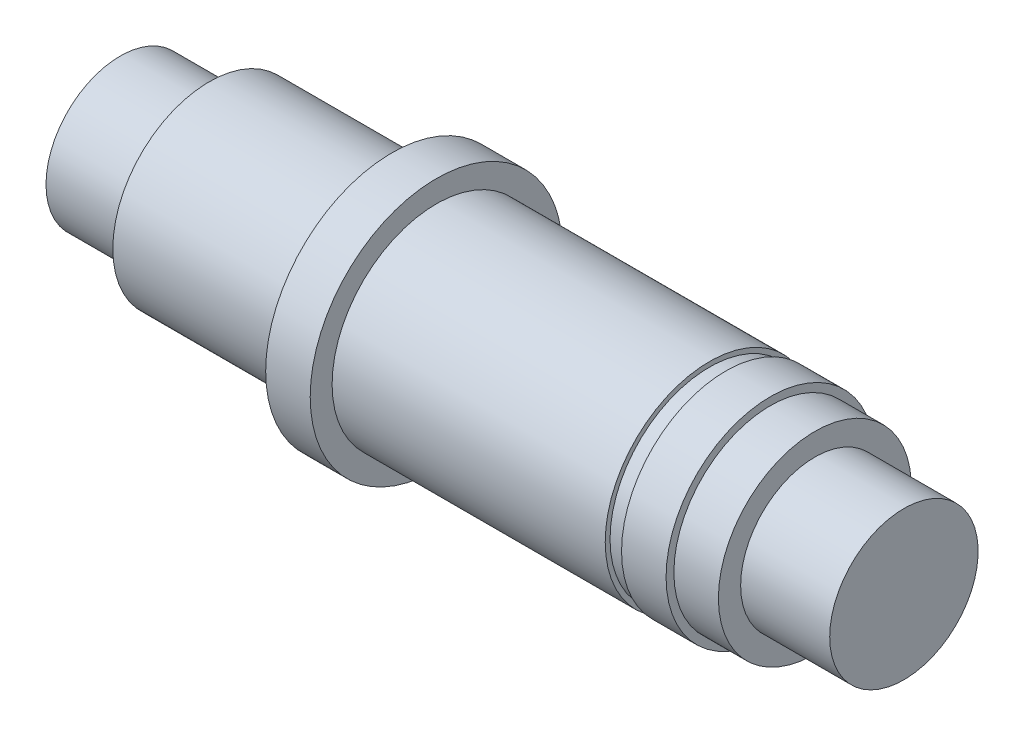
ISO-10303-21;
HEADER;
FILE_DESCRIPTION(('STEP AP214'),'2;1');
FILE_NAME('part.step','',(''),(''),'','','');
FILE_SCHEMA(('AUTOMOTIVE_DESIGN { 1 0 10303 214 1 1 1 1 }'));
ENDSEC;
DATA;
#1=APPLICATION_CONTEXT('core data for automotive mechanical design processes');
#2=APPLICATION_PROTOCOL_DEFINITION('international standard','automotive_design',2000,#1);
#3=PRODUCT_CONTEXT('',#1,'mechanical');
#4=PRODUCT('Part','Part','',(#3));
#5=PRODUCT_RELATED_PRODUCT_CATEGORY('part','',(#4));
#6=PRODUCT_DEFINITION_FORMATION('','',#4);
#7=PRODUCT_DEFINITION_CONTEXT('part definition',#1,'design');
#8=PRODUCT_DEFINITION('design','',#6,#7);
#9=PRODUCT_DEFINITION_SHAPE('','',#8);
#10=(LENGTH_UNIT() NAMED_UNIT(*) SI_UNIT(.MILLI.,.METRE.));
#11=(NAMED_UNIT(*) PLANE_ANGLE_UNIT() SI_UNIT($,.RADIAN.));
#12=(NAMED_UNIT(*) SI_UNIT($,.STERADIAN.) SOLID_ANGLE_UNIT());
#13=UNCERTAINTY_MEASURE_WITH_UNIT(LENGTH_MEASURE(1.E-05),#10,'distance_accuracy_value','');
#14=(GEOMETRIC_REPRESENTATION_CONTEXT(3) GLOBAL_UNCERTAINTY_ASSIGNED_CONTEXT((#13)) GLOBAL_UNIT_ASSIGNED_CONTEXT((#10,
#11,#12)) REPRESENTATION_CONTEXT('',''));
#15=CARTESIAN_POINT('',(0.,0.,0.));
#16=DIRECTION('',(0.,0.,1.));
#17=DIRECTION('',(1.,0.,0.));
#18=AXIS2_PLACEMENT_3D('',#15,#16,#17);
#19=CARTESIAN_POINT('',(46.8,0.,0.));
#20=DIRECTION('',(1.,0.,0.));
#21=DIRECTION('',(0.,0.,-1.));
#22=AXIS2_PLACEMENT_3D('',#19,#20,#21);
#23=PLANE('',#22);
#24=CARTESIAN_POINT('',(46.8,0.,0.));
#25=DIRECTION('',(-1.,0.,0.));
#26=DIRECTION('',(0.,0.,1.));
#27=AXIS2_PLACEMENT_3D('',#24,#25,#26);
#28=CIRCLE('',#27,5.);
#29=CARTESIAN_POINT('',(46.8,0.,5.));
#30=VERTEX_POINT('',#29);
#31=EDGE_CURVE('E106',#30,#30,#28,.T.);
#32=ORIENTED_EDGE('',*,*,#31,.T.);
#33=EDGE_LOOP('',(#32));
#34=FACE_BOUND('',#33,.T.);
#35=CARTESIAN_POINT('',(46.8,0.,0.));
#36=DIRECTION('',(-1.,0.,0.));
#37=DIRECTION('',(0.,0.,1.));
#38=AXIS2_PLACEMENT_3D('',#35,#36,#37);
#39=CIRCLE('',#38,6.5);
#40=CARTESIAN_POINT('',(46.8,0.,6.5));
#41=VERTEX_POINT('',#40);
#42=EDGE_CURVE('E10',#41,#41,#39,.T.);
#43=ORIENTED_EDGE('',*,*,#42,.F.);
#44=EDGE_LOOP('',(#43));
#45=FACE_BOUND('',#44,.T.);
#46=ADVANCED_FACE('F39',(#34,#45),#23,.T.);
#47=CARTESIAN_POINT('',(-13.6685201218921,0.,0.));
#48=DIRECTION('',(-1.,0.,0.));
#49=DIRECTION('',(0.,0.,1.));
#50=AXIS2_PLACEMENT_3D('',#47,#48,#49);
#51=CYLINDRICAL_SURFACE('',#50,6.5);
#52=ORIENTED_EDGE('',*,*,#42,.T.);
#53=EDGE_LOOP('',(#52));
#54=FACE_BOUND('',#53,.T.);
#55=CARTESIAN_POINT('',(43.8,0.,0.));
#56=DIRECTION('',(-1.,0.,0.));
#57=DIRECTION('',(0.,0.,1.));
#58=AXIS2_PLACEMENT_3D('',#55,#56,#57);
#59=CIRCLE('',#58,6.5);
#60=CARTESIAN_POINT('',(43.8,0.,6.5));
#61=VERTEX_POINT('',#60);
#62=EDGE_CURVE('E46',#61,#61,#59,.T.);
#63=ORIENTED_EDGE('',*,*,#62,.F.);
#64=EDGE_LOOP('',(#63));
#65=FACE_BOUND('',#64,.T.);
#66=ADVANCED_FACE('F125',(#54,#65),#51,.T.);
#67=CARTESIAN_POINT('',(43.8,0.,0.));
#68=DIRECTION('',(1.,0.,0.));
#69=DIRECTION('',(0.,0.,-1.));
#70=AXIS2_PLACEMENT_3D('',#67,#68,#69);
#71=PLANE('',#70);
#72=ORIENTED_EDGE('',*,*,#62,.T.);
#73=EDGE_LOOP('',(#72));
#74=FACE_BOUND('',#73,.T.);
#75=CARTESIAN_POINT('',(43.8,0.,0.));
#76=DIRECTION('',(-1.,0.,0.));
#77=DIRECTION('',(0.,0.,1.));
#78=AXIS2_PLACEMENT_3D('',#75,#76,#77);
#79=CIRCLE('',#78,7.025);
#80=CARTESIAN_POINT('',(43.8,0.,7.025));
#81=VERTEX_POINT('',#80);
#82=EDGE_CURVE('E51',#81,#81,#79,.T.);
#83=ORIENTED_EDGE('',*,*,#82,.F.);
#84=EDGE_LOOP('',(#83));
#85=FACE_BOUND('',#84,.T.);
#86=ADVANCED_FACE('F129',(#74,#85),#71,.T.);
#87=CARTESIAN_POINT('',(-13.6685201218921,0.,0.));
#88=DIRECTION('',(-1.,0.,0.));
#89=DIRECTION('',(0.,0.,1.));
#90=AXIS2_PLACEMENT_3D('',#87,#88,#89);
#91=CYLINDRICAL_SURFACE('',#90,7.025);
#92=ORIENTED_EDGE('',*,*,#82,.T.);
#93=EDGE_LOOP('',(#92));
#94=FACE_BOUND('',#93,.T.);
#95=CARTESIAN_POINT('',(40.8,0.,0.));
#96=DIRECTION('',(-1.,0.,0.));
#97=DIRECTION('',(0.,0.,1.));
#98=AXIS2_PLACEMENT_3D('',#95,#96,#97);
#99=CIRCLE('',#98,7.025);
#100=CARTESIAN_POINT('',(40.8,0.,7.025));
#101=VERTEX_POINT('',#100);
#102=EDGE_CURVE('E56',#101,#101,#99,.T.);
#103=ORIENTED_EDGE('',*,*,#102,.F.);
#104=EDGE_LOOP('',(#103));
#105=FACE_BOUND('',#104,.T.);
#106=ADVANCED_FACE('F133',(#94,#105),#91,.T.);
#107=CARTESIAN_POINT('',(40.8,0.,0.));
#108=DIRECTION('',(-1.,0.,0.));
#109=DIRECTION('',(0.,0.,1.));
#110=AXIS2_PLACEMENT_3D('',#107,#108,#109);
#111=PLANE('',#110);
#112=ORIENTED_EDGE('',*,*,#102,.T.);
#113=EDGE_LOOP('',(#112));
#114=FACE_BOUND('',#113,.T.);
#115=CARTESIAN_POINT('',(40.8,0.,0.));
#116=DIRECTION('',(-1.,0.,0.));
#117=DIRECTION('',(0.,0.,1.));
#118=AXIS2_PLACEMENT_3D('',#115,#116,#117);
#119=CIRCLE('',#118,6.7);
#120=CARTESIAN_POINT('',(40.8,0.,6.7));
#121=VERTEX_POINT('',#120);
#122=EDGE_CURVE('E62',#121,#121,#119,.T.);
#123=ORIENTED_EDGE('',*,*,#122,.F.);
#124=EDGE_LOOP('',(#123));
#125=FACE_BOUND('',#124,.T.);
#126=ADVANCED_FACE('F139',(#114,#125),#111,.T.);
#127=CARTESIAN_POINT('',(-13.6685201218921,0.,0.));
#128=DIRECTION('',(-1.,0.,0.));
#129=DIRECTION('',(0.,0.,1.));
#130=AXIS2_PLACEMENT_3D('',#127,#128,#129);
#131=CYLINDRICAL_SURFACE('',#130,6.7);
#132=ORIENTED_EDGE('',*,*,#122,.T.);
#133=EDGE_LOOP('',(#132));
#134=FACE_BOUND('',#133,.T.);
#135=CARTESIAN_POINT('',(39.7,0.,0.));
#136=DIRECTION('',(-1.,0.,0.));
#137=DIRECTION('',(0.,0.,1.));
#138=AXIS2_PLACEMENT_3D('',#135,#136,#137);
#139=CIRCLE('',#138,6.7);
#140=CARTESIAN_POINT('',(39.7,0.,6.7));
#141=VERTEX_POINT('',#140);
#142=EDGE_CURVE('E66',#141,#141,#139,.T.);
#143=ORIENTED_EDGE('',*,*,#142,.F.);
#144=EDGE_LOOP('',(#143));
#145=FACE_BOUND('',#144,.T.);
#146=ADVANCED_FACE('F143',(#134,#145),#131,.T.);
#147=CARTESIAN_POINT('',(39.7,0.,0.));
#148=DIRECTION('',(1.,0.,0.));
#149=DIRECTION('',(0.,0.,-1.));
#150=AXIS2_PLACEMENT_3D('',#147,#148,#149);
#151=PLANE('',#150);
#152=ORIENTED_EDGE('',*,*,#142,.T.);
#153=EDGE_LOOP('',(#152));
#154=FACE_BOUND('',#153,.T.);
#155=CARTESIAN_POINT('',(39.7,0.,0.));
#156=DIRECTION('',(-1.,0.,0.));
#157=DIRECTION('',(0.,0.,1.));
#158=AXIS2_PLACEMENT_3D('',#155,#156,#157);
#159=CIRCLE('',#158,7.025);
#160=CARTESIAN_POINT('',(39.7,0.,7.025));
#161=VERTEX_POINT('',#160);
#162=EDGE_CURVE('E70',#161,#161,#159,.T.);
#163=ORIENTED_EDGE('',*,*,#162,.F.);
#164=EDGE_LOOP('',(#163));
#165=FACE_BOUND('',#164,.T.);
#166=ADVANCED_FACE('F147',(#154,#165),#151,.T.);
#167=CARTESIAN_POINT('',(-13.6685201218921,0.,0.));
#168=DIRECTION('',(-1.,0.,0.));
#169=DIRECTION('',(0.,0.,1.));
#170=AXIS2_PLACEMENT_3D('',#167,#168,#169);
#171=CYLINDRICAL_SURFACE('',#170,7.025);
#172=ORIENTED_EDGE('',*,*,#162,.T.);
#173=EDGE_LOOP('',(#172));
#174=FACE_BOUND('',#173,.T.);
#175=CARTESIAN_POINT('',(21.3,0.,0.));
#176=DIRECTION('',(-1.,0.,0.));
#177=DIRECTION('',(0.,0.,1.));
#178=AXIS2_PLACEMENT_3D('',#175,#176,#177);
#179=CIRCLE('',#178,7.025);
#180=CARTESIAN_POINT('',(21.3,0.,7.025));
#181=VERTEX_POINT('',#180);
#182=EDGE_CURVE('E74',#181,#181,#179,.T.);
#183=ORIENTED_EDGE('',*,*,#182,.F.);
#184=EDGE_LOOP('',(#183));
#185=FACE_BOUND('',#184,.T.);
#186=ADVANCED_FACE('F151',(#174,#185),#171,.T.);
#187=CARTESIAN_POINT('',(21.3,0.,0.));
#188=DIRECTION('',(1.,0.,0.));
#189=DIRECTION('',(0.,0.,-1.));
#190=AXIS2_PLACEMENT_3D('',#187,#188,#189);
#191=PLANE('',#190);
#192=ORIENTED_EDGE('',*,*,#182,.T.);
#193=EDGE_LOOP('',(#192));
#194=FACE_BOUND('',#193,.T.);
#195=CARTESIAN_POINT('',(21.3,0.,0.));
#196=DIRECTION('',(-1.,0.,0.));
#197=DIRECTION('',(0.,0.,1.));
#198=AXIS2_PLACEMENT_3D('',#195,#196,#197);
#199=CIRCLE('',#198,8.5);
#200=CARTESIAN_POINT('',(21.3,0.,8.5));
#201=VERTEX_POINT('',#200);
#202=EDGE_CURVE('E78',#201,#201,#199,.T.);
#203=ORIENTED_EDGE('',*,*,#202,.F.);
#204=EDGE_LOOP('',(#203));
#205=FACE_BOUND('',#204,.T.);
#206=ADVANCED_FACE('F155',(#194,#205),#191,.T.);
#207=CARTESIAN_POINT('',(-13.6685201218921,0.,0.));
#208=DIRECTION('',(-1.,0.,0.));
#209=DIRECTION('',(0.,0.,1.));
#210=AXIS2_PLACEMENT_3D('',#207,#208,#209);
#211=CYLINDRICAL_SURFACE('',#210,8.5);
#212=ORIENTED_EDGE('',*,*,#202,.T.);
#213=EDGE_LOOP('',(#212));
#214=FACE_BOUND('',#213,.T.);
#215=CARTESIAN_POINT('',(18.3,0.,0.));
#216=DIRECTION('',(-1.,0.,0.));
#217=DIRECTION('',(0.,0.,1.));
#218=AXIS2_PLACEMENT_3D('',#215,#216,#217);
#219=CIRCLE('',#218,8.5);
#220=CARTESIAN_POINT('',(18.3,0.,8.5));
#221=VERTEX_POINT('',#220);
#222=EDGE_CURVE('E82',#221,#221,#219,.T.);
#223=ORIENTED_EDGE('',*,*,#222,.F.);
#224=EDGE_LOOP('',(#223));
#225=FACE_BOUND('',#224,.T.);
#226=ADVANCED_FACE('F159',(#214,#225),#211,.T.);
#227=CARTESIAN_POINT('',(18.3,0.,0.));
#228=DIRECTION('',(-1.,0.,0.));
#229=DIRECTION('',(0.,0.,1.));
#230=AXIS2_PLACEMENT_3D('',#227,#228,#229);
#231=PLANE('',#230);
#232=ORIENTED_EDGE('',*,*,#222,.T.);
#233=EDGE_LOOP('',(#232));
#234=FACE_BOUND('',#233,.T.);
#235=CARTESIAN_POINT('',(18.3,0.,0.));
#236=DIRECTION('',(-1.,0.,0.));
#237=DIRECTION('',(0.,0.,1.));
#238=AXIS2_PLACEMENT_3D('',#235,#236,#237);
#239=CIRCLE('',#238,6.5);
#240=CARTESIAN_POINT('',(18.3,0.,6.5));
#241=VERTEX_POINT('',#240);
#242=EDGE_CURVE('E86',#241,#241,#239,.T.);
#243=ORIENTED_EDGE('',*,*,#242,.F.);
#244=EDGE_LOOP('',(#243));
#245=FACE_BOUND('',#244,.T.);
#246=ADVANCED_FACE('F163',(#234,#245),#231,.T.);
#247=CARTESIAN_POINT('',(-13.6685201218921,0.,0.));
#248=DIRECTION('',(-1.,0.,0.));
#249=DIRECTION('',(0.,0.,1.));
#250=AXIS2_PLACEMENT_3D('',#247,#248,#249);
#251=CYLINDRICAL_SURFACE('',#250,6.5);
#252=ORIENTED_EDGE('',*,*,#242,.T.);
#253=EDGE_LOOP('',(#252));
#254=FACE_BOUND('',#253,.T.);
#255=CARTESIAN_POINT('',(6.,0.,0.));
#256=DIRECTION('',(-1.,0.,0.));
#257=DIRECTION('',(0.,0.,1.));
#258=AXIS2_PLACEMENT_3D('',#255,#256,#257);
#259=CIRCLE('',#258,6.5);
#260=CARTESIAN_POINT('',(6.,0.,6.5));
#261=VERTEX_POINT('',#260);
#262=EDGE_CURVE('E90',#261,#261,#259,.T.);
#263=ORIENTED_EDGE('',*,*,#262,.F.);
#264=EDGE_LOOP('',(#263));
#265=FACE_BOUND('',#264,.T.);
#266=ADVANCED_FACE('F167',(#254,#265),#251,.T.);
#267=CARTESIAN_POINT('',(6.,0.,0.));
#268=DIRECTION('',(-1.,0.,0.));
#269=DIRECTION('',(0.,0.,1.));
#270=AXIS2_PLACEMENT_3D('',#267,#268,#269);
#271=PLANE('',#270);
#272=ORIENTED_EDGE('',*,*,#262,.T.);
#273=EDGE_LOOP('',(#272));
#274=FACE_BOUND('',#273,.T.);
#275=CARTESIAN_POINT('',(6.,0.,0.));
#276=DIRECTION('',(-1.,0.,0.));
#277=DIRECTION('',(0.,0.,1.));
#278=AXIS2_PLACEMENT_3D('',#275,#276,#277);
#279=CIRCLE('',#278,5.);
#280=CARTESIAN_POINT('',(6.,0.,5.));
#281=VERTEX_POINT('',#280);
#282=EDGE_CURVE('E94',#281,#281,#279,.T.);
#283=ORIENTED_EDGE('',*,*,#282,.F.);
#284=EDGE_LOOP('',(#283));
#285=FACE_BOUND('',#284,.T.);
#286=ADVANCED_FACE('F171',(#274,#285),#271,.T.);
#287=CARTESIAN_POINT('',(-13.6685201218921,0.,0.));
#288=DIRECTION('',(-1.,0.,0.));
#289=DIRECTION('',(0.,0.,1.));
#290=AXIS2_PLACEMENT_3D('',#287,#288,#289);
#291=CYLINDRICAL_SURFACE('',#290,5.);
#292=ORIENTED_EDGE('',*,*,#282,.T.);
#293=EDGE_LOOP('',(#292));
#294=FACE_BOUND('',#293,.T.);
#295=CARTESIAN_POINT('',(0.,0.,0.));
#296=DIRECTION('',(-1.,0.,0.));
#297=DIRECTION('',(0.,0.,1.));
#298=AXIS2_PLACEMENT_3D('',#295,#296,#297);
#299=CIRCLE('',#298,5.);
#300=CARTESIAN_POINT('',(0.,0.,5.));
#301=VERTEX_POINT('',#300);
#302=EDGE_CURVE('E98',#301,#301,#299,.T.);
#303=ORIENTED_EDGE('',*,*,#302,.F.);
#304=EDGE_LOOP('',(#303));
#305=FACE_BOUND('',#304,.T.);
#306=ADVANCED_FACE('F175',(#294,#305),#291,.T.);
#307=CARTESIAN_POINT('',(0.,0.,0.));
#308=DIRECTION('',(-1.,0.,0.));
#309=DIRECTION('',(0.,0.,1.));
#310=AXIS2_PLACEMENT_3D('',#307,#308,#309);
#311=PLANE('',#310);
#312=ORIENTED_EDGE('',*,*,#302,.T.);
#313=EDGE_LOOP('',(#312));
#314=FACE_BOUND('',#313,.T.);
#315=ADVANCED_FACE('F121',(#314),#311,.T.);
#316=CARTESIAN_POINT('',(52.8,0.,0.));
#317=DIRECTION('',(1.,0.,0.));
#318=DIRECTION('',(0.,0.,-1.));
#319=AXIS2_PLACEMENT_3D('',#316,#317,#318);
#320=PLANE('',#319);
#321=CARTESIAN_POINT('',(52.8,0.,0.));
#322=DIRECTION('',(-1.,0.,0.));
#323=DIRECTION('',(0.,0.,1.));
#324=AXIS2_PLACEMENT_3D('',#321,#322,#323);
#325=CIRCLE('',#324,5.);
#326=CARTESIAN_POINT('',(52.8,0.,5.));
#327=VERTEX_POINT('',#326);
#328=EDGE_CURVE('E102',#327,#327,#325,.T.);
#329=ORIENTED_EDGE('',*,*,#328,.F.);
#330=EDGE_LOOP('',(#329));
#331=FACE_BOUND('',#330,.T.);
#332=ADVANCED_FACE('F115',(#331),#320,.T.);
#333=CARTESIAN_POINT('',(-13.6685201218921,0.,0.));
#334=DIRECTION('',(-1.,0.,0.));
#335=DIRECTION('',(0.,0.,1.));
#336=AXIS2_PLACEMENT_3D('',#333,#334,#335);
#337=CYLINDRICAL_SURFACE('',#336,5.);
#338=ORIENTED_EDGE('',*,*,#328,.T.);
#339=EDGE_LOOP('',(#338));
#340=FACE_BOUND('',#339,.T.);
#341=ORIENTED_EDGE('',*,*,#31,.F.);
#342=EDGE_LOOP('',(#341));
#343=FACE_BOUND('',#342,.T.);
#344=ADVANCED_FACE('F113',(#340,#343),#337,.T.);
#345=CLOSED_SHELL('',(#46,#66,#86,#106,#126,#146,#166,#186,#206,#226,#246,#266,#286,#306,#315,
#332,#344));
#346=MANIFOLD_SOLID_BREP('B2',#345);
#347=ADVANCED_BREP_SHAPE_REPRESENTATION('',(#18,#346),#14);
#348=SHAPE_DEFINITION_REPRESENTATION(#9,#347);
ENDSEC;
END-ISO-10303-21;
